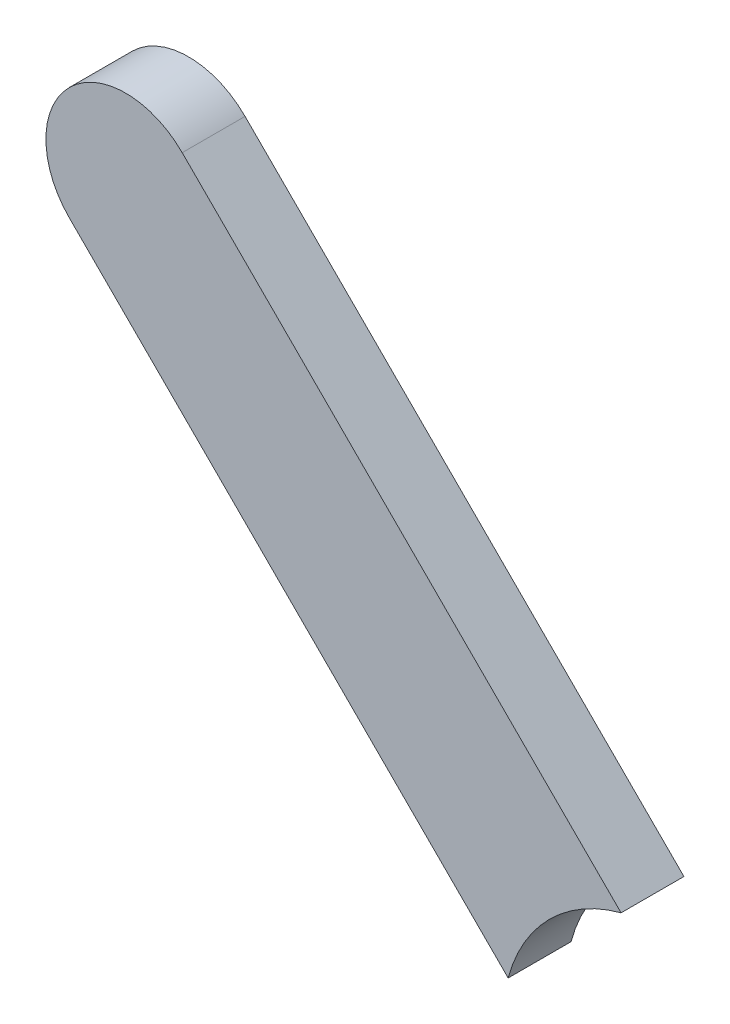
ISO-10303-21;
HEADER;
FILE_DESCRIPTION(('STEP AP214'),'2;1');
FILE_NAME('part.step','',(''),(''),'','','');
FILE_SCHEMA(('AUTOMOTIVE_DESIGN { 1 0 10303 214 1 1 1 1 }'));
ENDSEC;
DATA;
#1=APPLICATION_CONTEXT('core data for automotive mechanical design processes');
#2=APPLICATION_PROTOCOL_DEFINITION('international standard','automotive_design',2000,#1);
#3=PRODUCT_CONTEXT('',#1,'mechanical');
#4=PRODUCT('Part','Part','',(#3));
#5=PRODUCT_RELATED_PRODUCT_CATEGORY('part','',(#4));
#6=PRODUCT_DEFINITION_FORMATION('','',#4);
#7=PRODUCT_DEFINITION_CONTEXT('part definition',#1,'design');
#8=PRODUCT_DEFINITION('design','',#6,#7);
#9=PRODUCT_DEFINITION_SHAPE('','',#8);
#10=(LENGTH_UNIT() NAMED_UNIT(*) SI_UNIT(.MILLI.,.METRE.));
#11=(NAMED_UNIT(*) PLANE_ANGLE_UNIT() SI_UNIT($,.RADIAN.));
#12=(NAMED_UNIT(*) SI_UNIT($,.STERADIAN.) SOLID_ANGLE_UNIT());
#13=UNCERTAINTY_MEASURE_WITH_UNIT(LENGTH_MEASURE(1.E-05),#10,'distance_accuracy_value','');
#14=(GEOMETRIC_REPRESENTATION_CONTEXT(3) GLOBAL_UNCERTAINTY_ASSIGNED_CONTEXT((#13)) GLOBAL_UNIT_ASSIGNED_CONTEXT((#10,
#11,#12)) REPRESENTATION_CONTEXT('',''));
#15=CARTESIAN_POINT('',(0.,0.,0.));
#16=DIRECTION('',(0.,0.,1.));
#17=DIRECTION('',(1.,0.,0.));
#18=AXIS2_PLACEMENT_3D('',#15,#16,#17);
#19=CARTESIAN_POINT('',(150.893907,70.48888366,0.));
#20=DIRECTION('',(0.707106781186545,0.707106781186551,0.));
#21=DIRECTION('',(0.707106781186551,-0.707106781186545,0.));
#22=AXIS2_PLACEMENT_3D('',#19,#20,#21);
#23=PLANE('',#22);
#24=DIRECTION('',(0.707106781186551,-0.707106781186545,0.));
#25=VECTOR('',#24,1.);
#26=CARTESIAN_POINT('',(150.893907,70.48888366,0.1999996));
#27=LINE('',#26,#25);
#28=CARTESIAN_POINT('',(150.893907,70.48888366,0.1999996));
#29=VERTEX_POINT('',#28);
#30=CARTESIAN_POINT('',(152.290309871461,69.0924807885386,0.1999996));
#31=VERTEX_POINT('',#30);
#32=EDGE_CURVE('E11',#29,#31,#27,.T.);
#33=ORIENTED_EDGE('',*,*,#32,.F.);
#34=DIRECTION('',(0.,0.,1.));
#35=VECTOR('',#34,1.);
#36=CARTESIAN_POINT('',(150.893907,70.48888366,0.));
#37=LINE('',#36,#35);
#38=CARTESIAN_POINT('',(150.893907,70.48888366,0.));
#39=VERTEX_POINT('',#38);
#40=EDGE_CURVE('E24',#39,#29,#37,.T.);
#41=ORIENTED_EDGE('',*,*,#40,.F.);
#42=DIRECTION('',(0.707106781186551,-0.707106781186545,0.));
#43=VECTOR('',#42,1.);
#44=CARTESIAN_POINT('',(150.893907,70.48888366,0.));
#45=LINE('',#44,#43);
#46=CARTESIAN_POINT('',(152.290309871461,69.0924807885386,0.));
#47=VERTEX_POINT('',#46);
#48=EDGE_CURVE('E75',#39,#47,#45,.T.);
#49=ORIENTED_EDGE('',*,*,#48,.T.);
#50=DIRECTION('',(0.,0.,1.));
#51=VECTOR('',#50,1.);
#52=CARTESIAN_POINT('',(152.290309871461,69.0924807885386,0.));
#53=LINE('',#52,#51);
#54=EDGE_CURVE('E37',#47,#31,#53,.T.);
#55=ORIENTED_EDGE('',*,*,#54,.T.);
#56=EDGE_LOOP('',(#33,#41,#49,#55));
#57=FACE_BOUND('',#56,.T.);
#58=ADVANCED_FACE('F17',(#57),#23,.F.);
#59=CARTESIAN_POINT('',(152.781,68.961,0.));
#60=DIRECTION('',(0.,0.,-1.));
#61=DIRECTION('',(1.,0.,0.));
#62=AXIS2_PLACEMENT_3D('',#59,#60,#61);
#63=CYLINDRICAL_SURFACE('',#62,0.508);
#64=DIRECTION('',(0.,0.,1.));
#65=VECTOR('',#64,1.);
#66=CARTESIAN_POINT('',(152.649519211461,69.4516901285386,0.));
#67=LINE('',#66,#65);
#68=CARTESIAN_POINT('',(152.649519211461,69.4516901285386,0.));
#69=VERTEX_POINT('',#68);
#70=CARTESIAN_POINT('',(152.649519211461,69.4516901285386,0.1999996));
#71=VERTEX_POINT('',#70);
#72=EDGE_CURVE('E67',#69,#71,#67,.T.);
#73=ORIENTED_EDGE('',*,*,#72,.T.);
#74=CARTESIAN_POINT('',(152.781,68.961,0.1999996));
#75=DIRECTION('',(0.,0.,1.));
#76=DIRECTION('',(1.,0.,0.));
#77=AXIS2_PLACEMENT_3D('',#74,#75,#76);
#78=CIRCLE('',#77,0.508);
#79=EDGE_CURVE('E82',#71,#31,#78,.T.);
#80=ORIENTED_EDGE('',*,*,#79,.T.);
#81=ORIENTED_EDGE('',*,*,#54,.F.);
#82=CARTESIAN_POINT('',(152.781,68.961,0.));
#83=DIRECTION('',(0.,0.,1.));
#84=DIRECTION('',(1.,0.,0.));
#85=AXIS2_PLACEMENT_3D('',#82,#83,#84);
#86=CIRCLE('',#85,0.508);
#87=EDGE_CURVE('E80',#69,#47,#86,.T.);
#88=ORIENTED_EDGE('',*,*,#87,.F.);
#89=EDGE_LOOP('',(#73,#80,#81,#88));
#90=FACE_BOUND('',#89,.T.);
#91=ADVANCED_FACE('F88',(#90),#63,.F.);
#92=CARTESIAN_POINT('',(152.649519211461,69.4516901285386,0.));
#93=DIRECTION('',(-0.707106781186545,-0.707106781186551,0.));
#94=DIRECTION('',(-0.707106781186551,0.707106781186545,0.));
#95=AXIS2_PLACEMENT_3D('',#92,#93,#94);
#96=PLANE('',#95);
#97=DIRECTION('',(-0.707106781186551,0.707106781186545,0.));
#98=VECTOR('',#97,1.);
#99=CARTESIAN_POINT('',(152.9606034,69.14060594,0.1999996));
#100=LINE('',#99,#98);
#101=CARTESIAN_POINT('',(151.25311634,70.848093,0.1999996));
#102=VERTEX_POINT('',#101);
#103=EDGE_CURVE('E71',#71,#102,#100,.T.);
#104=ORIENTED_EDGE('',*,*,#103,.F.);
#105=ORIENTED_EDGE('',*,*,#72,.F.);
#106=DIRECTION('',(-0.707106781186551,0.707106781186545,0.));
#107=VECTOR('',#106,1.);
#108=CARTESIAN_POINT('',(152.9606034,69.14060594,0.));
#109=LINE('',#108,#107);
#110=CARTESIAN_POINT('',(151.25311634,70.848093,0.));
#111=VERTEX_POINT('',#110);
#112=EDGE_CURVE('E63',#69,#111,#109,.T.);
#113=ORIENTED_EDGE('',*,*,#112,.T.);
#114=DIRECTION('',(0.,0.,1.));
#115=VECTOR('',#114,1.);
#116=CARTESIAN_POINT('',(151.25311634,70.848093,0.));
#117=LINE('',#116,#115);
#118=EDGE_CURVE('E53',#111,#102,#117,.T.);
#119=ORIENTED_EDGE('',*,*,#118,.T.);
#120=EDGE_LOOP('',(#104,#105,#113,#119));
#121=FACE_BOUND('',#120,.T.);
#122=ADVANCED_FACE('F66',(#121),#96,.F.);
#123=CARTESIAN_POINT('',(151.07351167,70.66848833,0.));
#124=DIRECTION('',(0.,0.,-1.));
#125=DIRECTION('',(0.707106781186576,0.70710678118652,0.));
#126=AXIS2_PLACEMENT_3D('',#123,#124,#125);
#127=CYLINDRICAL_SURFACE('',#126,0.253999360179542);
#128=CARTESIAN_POINT('',(151.07351167,70.66848833,0.1999996));
#129=DIRECTION('',(0.,0.,1.));
#130=DIRECTION('',(0.707106781186576,0.70710678118652,0.));
#131=AXIS2_PLACEMENT_3D('',#128,#129,#130);
#132=CIRCLE('',#131,0.253999360179542);
#133=EDGE_CURVE('E59',#102,#29,#132,.T.);
#134=ORIENTED_EDGE('',*,*,#133,.F.);
#135=ORIENTED_EDGE('',*,*,#118,.F.);
#136=CARTESIAN_POINT('',(151.07351167,70.66848833,0.));
#137=DIRECTION('',(0.,0.,1.));
#138=DIRECTION('',(0.707106781186576,0.70710678118652,0.));
#139=AXIS2_PLACEMENT_3D('',#136,#137,#138);
#140=CIRCLE('',#139,0.253999360179542);
#141=EDGE_CURVE('E57',#111,#39,#140,.T.);
#142=ORIENTED_EDGE('',*,*,#141,.T.);
#143=ORIENTED_EDGE('',*,*,#40,.T.);
#144=EDGE_LOOP('',(#134,#135,#142,#143));
#145=FACE_BOUND('',#144,.T.);
#146=ADVANCED_FACE('F55',(#145),#127,.T.);
#147=CARTESIAN_POINT('',(150.893907,70.48888366,0.));
#148=DIRECTION('',(0.,0.,-1.));
#149=DIRECTION('',(-1.,0.,0.));
#150=AXIS2_PLACEMENT_3D('',#147,#148,#149);
#151=PLANE('',#150);
#152=ORIENTED_EDGE('',*,*,#48,.F.);
#153=ORIENTED_EDGE('',*,*,#141,.F.);
#154=ORIENTED_EDGE('',*,*,#112,.F.);
#155=ORIENTED_EDGE('',*,*,#87,.T.);
#156=EDGE_LOOP('',(#152,#153,#154,#155));
#157=FACE_BOUND('',#156,.T.);
#158=ADVANCED_FACE('F74',(#157),#151,.T.);
#159=CARTESIAN_POINT('',(150.893907,70.48888366,0.1999996));
#160=DIRECTION('',(0.,0.,-1.));
#161=DIRECTION('',(-1.,0.,0.));
#162=AXIS2_PLACEMENT_3D('',#159,#160,#161);
#163=PLANE('',#162);
#164=ORIENTED_EDGE('',*,*,#133,.T.);
#165=ORIENTED_EDGE('',*,*,#32,.T.);
#166=ORIENTED_EDGE('',*,*,#79,.F.);
#167=ORIENTED_EDGE('',*,*,#103,.T.);
#168=EDGE_LOOP('',(#164,#165,#166,#167));
#169=FACE_BOUND('',#168,.T.);
#170=ADVANCED_FACE('F91',(#169),#163,.F.);
#171=CLOSED_SHELL('',(#58,#91,#122,#146,#158,#170));
#172=MANIFOLD_SOLID_BREP('B1',#171);
#173=ADVANCED_BREP_SHAPE_REPRESENTATION('',(#18,#172),#14);
#174=SHAPE_DEFINITION_REPRESENTATION(#9,#173);
ENDSEC;
END-ISO-10303-21;
